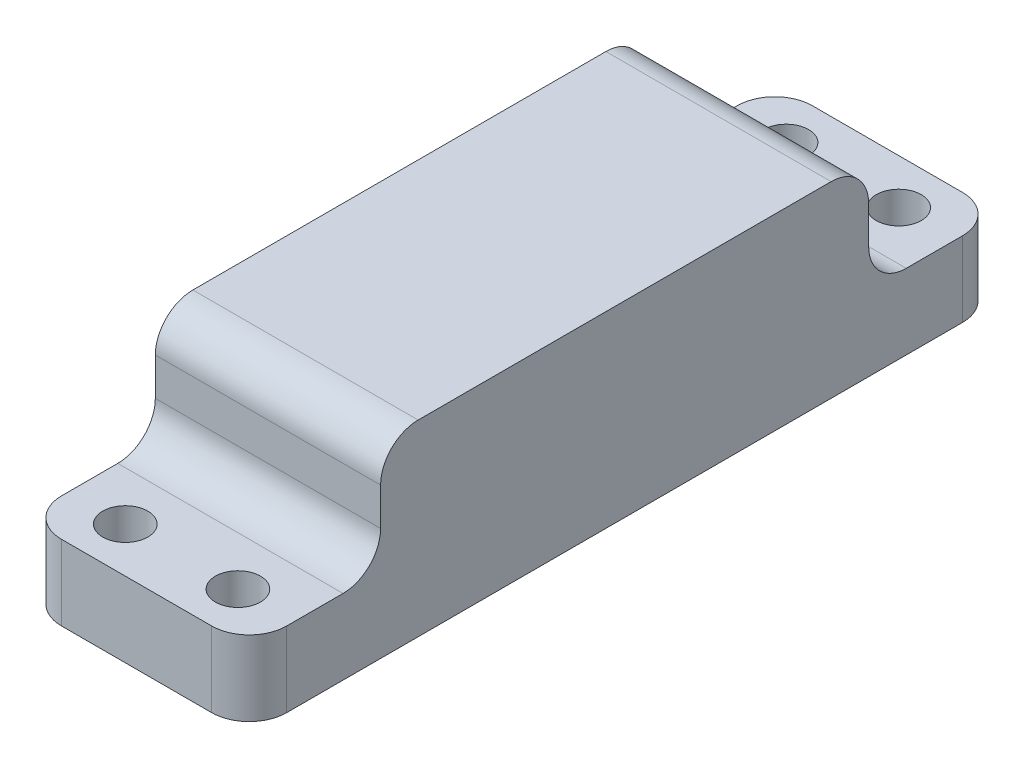
ISO-10303-21;
HEADER;
FILE_DESCRIPTION(('STEP AP214'),'2;1');
FILE_NAME('part.step','',(''),(''),'','','');
FILE_SCHEMA(('AUTOMOTIVE_DESIGN { 1 0 10303 214 1 1 1 1 }'));
ENDSEC;
DATA;
#1=APPLICATION_CONTEXT('core data for automotive mechanical design processes');
#2=APPLICATION_PROTOCOL_DEFINITION('international standard','automotive_design',2000,#1);
#3=PRODUCT_CONTEXT('',#1,'mechanical');
#4=PRODUCT('Part','Part','',(#3));
#5=PRODUCT_RELATED_PRODUCT_CATEGORY('part','',(#4));
#6=PRODUCT_DEFINITION_FORMATION('','',#4);
#7=PRODUCT_DEFINITION_CONTEXT('part definition',#1,'design');
#8=PRODUCT_DEFINITION('design','',#6,#7);
#9=PRODUCT_DEFINITION_SHAPE('','',#8);
#10=(LENGTH_UNIT() NAMED_UNIT(*) SI_UNIT(.MILLI.,.METRE.));
#11=(NAMED_UNIT(*) PLANE_ANGLE_UNIT() SI_UNIT($,.RADIAN.));
#12=(NAMED_UNIT(*) SI_UNIT($,.STERADIAN.) SOLID_ANGLE_UNIT());
#13=UNCERTAINTY_MEASURE_WITH_UNIT(LENGTH_MEASURE(1.E-05),#10,'distance_accuracy_value','');
#14=(GEOMETRIC_REPRESENTATION_CONTEXT(3) GLOBAL_UNCERTAINTY_ASSIGNED_CONTEXT((#13)) GLOBAL_UNIT_ASSIGNED_CONTEXT((#10,
#11,#12)) REPRESENTATION_CONTEXT('',''));
#15=CARTESIAN_POINT('',(0.,0.,0.));
#16=DIRECTION('',(0.,0.,1.));
#17=DIRECTION('',(1.,0.,0.));
#18=AXIS2_PLACEMENT_3D('',#15,#16,#17);
#19=CARTESIAN_POINT('',(-50.,30.,-10.));
#20=DIRECTION('',(0.,1.,0.));
#21=DIRECTION('',(0.,0.,1.));
#22=AXIS2_PLACEMENT_3D('',#19,#20,#21);
#23=CYLINDRICAL_SURFACE('',#22,10.);
#24=DIRECTION('',(0.,1.,0.));
#25=VECTOR('',#24,1.);
#26=CARTESIAN_POINT('',(-60.,30.,-10.));
#27=LINE('',#26,#25);
#28=CARTESIAN_POINT('',(-60.,0.,-10.));
#29=VERTEX_POINT('',#28);
#30=CARTESIAN_POINT('',(-60.,20.,-10.));
#31=VERTEX_POINT('',#30);
#32=EDGE_CURVE('E327',#29,#31,#27,.T.);
#33=ORIENTED_EDGE('',*,*,#32,.F.);
#34=CARTESIAN_POINT('',(-50.,0.,-10.));
#35=DIRECTION('',(0.,-1.,0.));
#36=DIRECTION('',(0.,0.,-1.));
#37=AXIS2_PLACEMENT_3D('',#34,#35,#36);
#38=CIRCLE('',#37,10.);
#39=CARTESIAN_POINT('',(-50.,0.,0.));
#40=VERTEX_POINT('',#39);
#41=EDGE_CURVE('E53',#40,#29,#38,.T.);
#42=ORIENTED_EDGE('',*,*,#41,.F.);
#43=DIRECTION('',(0.,1.,0.));
#44=VECTOR('',#43,1.);
#45=CARTESIAN_POINT('',(-50.,0.,0.));
#46=LINE('',#45,#44);
#47=CARTESIAN_POINT('',(-50.,20.,0.));
#48=VERTEX_POINT('',#47);
#49=EDGE_CURVE('E331',#48,#40,#46,.F.);
#50=ORIENTED_EDGE('',*,*,#49,.F.);
#51=CARTESIAN_POINT('',(-50.,20.,-10.));
#52=DIRECTION('',(0.,1.,0.));
#53=DIRECTION('',(0.,0.,1.));
#54=AXIS2_PLACEMENT_3D('',#51,#52,#53);
#55=CIRCLE('',#54,10.);
#56=EDGE_CURVE('E11',#31,#48,#55,.T.);
#57=ORIENTED_EDGE('',*,*,#56,.F.);
#58=EDGE_LOOP('',(#33,#42,#50,#57));
#59=FACE_BOUND('',#58,.T.);
#60=ADVANCED_FACE('F45',(#59),#23,.T.);
#61=CARTESIAN_POINT('',(-10.,30.,-10.));
#62=DIRECTION('',(0.,1.,0.));
#63=DIRECTION('',(0.,0.,1.));
#64=AXIS2_PLACEMENT_3D('',#61,#62,#63);
#65=CYLINDRICAL_SURFACE('',#64,10.);
#66=DIRECTION('',(0.,-1.,0.));
#67=VECTOR('',#66,1.);
#68=CARTESIAN_POINT('',(0.,30.,-10.));
#69=LINE('',#68,#67);
#70=CARTESIAN_POINT('',(0.,20.,-10.));
#71=VERTEX_POINT('',#70);
#72=CARTESIAN_POINT('',(0.,0.,-10.));
#73=VERTEX_POINT('',#72);
#74=EDGE_CURVE('E312',#71,#73,#69,.T.);
#75=ORIENTED_EDGE('',*,*,#74,.F.);
#76=CARTESIAN_POINT('',(-10.,20.,-10.));
#77=DIRECTION('',(0.,1.,0.));
#78=DIRECTION('',(0.,0.,1.));
#79=AXIS2_PLACEMENT_3D('',#76,#77,#78);
#80=CIRCLE('',#79,10.);
#81=CARTESIAN_POINT('',(-10.,20.,0.));
#82=VERTEX_POINT('',#81);
#83=EDGE_CURVE('E320',#82,#71,#80,.T.);
#84=ORIENTED_EDGE('',*,*,#83,.F.);
#85=DIRECTION('',(0.,-1.,0.));
#86=VECTOR('',#85,1.);
#87=CARTESIAN_POINT('',(-10.,30.,0.));
#88=LINE('',#87,#86);
#89=CARTESIAN_POINT('',(-10.,0.,0.));
#90=VERTEX_POINT('',#89);
#91=EDGE_CURVE('E316',#90,#82,#88,.F.);
#92=ORIENTED_EDGE('',*,*,#91,.F.);
#93=CARTESIAN_POINT('',(-10.,0.,-10.));
#94=DIRECTION('',(0.,-1.,0.));
#95=DIRECTION('',(0.,0.,-1.));
#96=AXIS2_PLACEMENT_3D('',#93,#94,#95);
#97=CIRCLE('',#96,10.);
#98=EDGE_CURVE('E323',#73,#90,#97,.T.);
#99=ORIENTED_EDGE('',*,*,#98,.F.);
#100=EDGE_LOOP('',(#75,#84,#92,#99));
#101=FACE_BOUND('',#100,.T.);
#102=ADVANCED_FACE('F453',(#101),#65,.T.);
#103=CARTESIAN_POINT('',(-10.,20.,-190.));
#104=DIRECTION('',(0.,1.,0.));
#105=DIRECTION('',(0.,0.,1.));
#106=AXIS2_PLACEMENT_3D('',#103,#104,#105);
#107=CYLINDRICAL_SURFACE('',#106,10.);
#108=DIRECTION('',(0.,-1.,0.));
#109=VECTOR('',#108,1.);
#110=CARTESIAN_POINT('',(-10.,20.,-200.));
#111=LINE('',#110,#109);
#112=CARTESIAN_POINT('',(-10.,20.,-200.));
#113=VERTEX_POINT('',#112);
#114=CARTESIAN_POINT('',(-10.,0.,-200.));
#115=VERTEX_POINT('',#114);
#116=EDGE_CURVE('E297',#113,#115,#111,.T.);
#117=ORIENTED_EDGE('',*,*,#116,.F.);
#118=CARTESIAN_POINT('',(-10.,20.,-190.));
#119=DIRECTION('',(0.,1.,0.));
#120=DIRECTION('',(0.,0.,1.));
#121=AXIS2_PLACEMENT_3D('',#118,#119,#120);
#122=CIRCLE('',#121,10.);
#123=CARTESIAN_POINT('',(0.,20.,-190.));
#124=VERTEX_POINT('',#123);
#125=EDGE_CURVE('E305',#124,#113,#122,.T.);
#126=ORIENTED_EDGE('',*,*,#125,.F.);
#127=DIRECTION('',(0.,-1.,0.));
#128=VECTOR('',#127,1.);
#129=CARTESIAN_POINT('',(0.,20.,-190.));
#130=LINE('',#129,#128);
#131=CARTESIAN_POINT('',(0.,0.,-190.));
#132=VERTEX_POINT('',#131);
#133=EDGE_CURVE('E301',#132,#124,#130,.F.);
#134=ORIENTED_EDGE('',*,*,#133,.F.);
#135=CARTESIAN_POINT('',(-10.,0.,-190.));
#136=DIRECTION('',(0.,-1.,0.));
#137=DIRECTION('',(0.,0.,-1.));
#138=AXIS2_PLACEMENT_3D('',#135,#136,#137);
#139=CIRCLE('',#138,10.);
#140=EDGE_CURVE('E308',#115,#132,#139,.T.);
#141=ORIENTED_EDGE('',*,*,#140,.F.);
#142=EDGE_LOOP('',(#117,#126,#134,#141));
#143=FACE_BOUND('',#142,.T.);
#144=ADVANCED_FACE('F441',(#143),#107,.T.);
#145=CARTESIAN_POINT('',(-50.,20.,-190.));
#146=DIRECTION('',(0.,1.,0.));
#147=DIRECTION('',(0.,0.,1.));
#148=AXIS2_PLACEMENT_3D('',#145,#146,#147);
#149=CYLINDRICAL_SURFACE('',#148,10.);
#150=DIRECTION('',(0.,1.,0.));
#151=VECTOR('',#150,1.);
#152=CARTESIAN_POINT('',(-50.,20.,-200.));
#153=LINE('',#152,#151);
#154=CARTESIAN_POINT('',(-50.,0.,-200.));
#155=VERTEX_POINT('',#154);
#156=CARTESIAN_POINT('',(-50.,20.,-200.));
#157=VERTEX_POINT('',#156);
#158=EDGE_CURVE('E256',#155,#157,#153,.T.);
#159=ORIENTED_EDGE('',*,*,#158,.F.);
#160=CARTESIAN_POINT('',(-50.,0.,-190.));
#161=DIRECTION('',(0.,-1.,0.));
#162=DIRECTION('',(0.,0.,-1.));
#163=AXIS2_PLACEMENT_3D('',#160,#161,#162);
#164=CIRCLE('',#163,10.);
#165=CARTESIAN_POINT('',(-60.,0.,-190.));
#166=VERTEX_POINT('',#165);
#167=EDGE_CURVE('E292',#166,#155,#164,.T.);
#168=ORIENTED_EDGE('',*,*,#167,.F.);
#169=DIRECTION('',(0.,1.,0.));
#170=VECTOR('',#169,1.);
#171=CARTESIAN_POINT('',(-60.,30.,-190.));
#172=LINE('',#171,#170);
#173=CARTESIAN_POINT('',(-60.,20.,-190.));
#174=VERTEX_POINT('',#173);
#175=EDGE_CURVE('E289',#174,#166,#172,.F.);
#176=ORIENTED_EDGE('',*,*,#175,.F.);
#177=CARTESIAN_POINT('',(-50.,20.,-190.));
#178=DIRECTION('',(0.,1.,0.));
#179=DIRECTION('',(0.,0.,1.));
#180=AXIS2_PLACEMENT_3D('',#177,#178,#179);
#181=CIRCLE('',#180,10.);
#182=EDGE_CURVE('E162',#157,#174,#181,.T.);
#183=ORIENTED_EDGE('',*,*,#182,.F.);
#184=EDGE_LOOP('',(#159,#168,#176,#183));
#185=FACE_BOUND('',#184,.T.);
#186=ADVANCED_FACE('F447',(#185),#149,.T.);
#187=CARTESIAN_POINT('',(-60.,0.,-200.));
#188=DIRECTION('',(0.,-1.,0.));
#189=DIRECTION('',(0.,0.,-1.));
#190=AXIS2_PLACEMENT_3D('',#187,#188,#189);
#191=PLANE('',#190);
#192=CARTESIAN_POINT('',(-15.,0.,-12.));
#193=DIRECTION('',(0.,1.,0.));
#194=DIRECTION('',(0.,0.,1.));
#195=AXIS2_PLACEMENT_3D('',#192,#193,#194);
#196=CIRCLE('',#195,3.99999999999999);
#197=CARTESIAN_POINT('',(-15.,0.,-8.00000000000001));
#198=VERTEX_POINT('',#197);
#199=EDGE_CURVE('E388',#198,#198,#196,.T.);
#200=ORIENTED_EDGE('',*,*,#199,.T.);
#201=EDGE_LOOP('',(#200));
#202=FACE_BOUND('',#201,.T.);
#203=CARTESIAN_POINT('',(-45.,0.,-12.));
#204=DIRECTION('',(0.,1.,0.));
#205=DIRECTION('',(0.,0.,1.));
#206=AXIS2_PLACEMENT_3D('',#203,#204,#205);
#207=CIRCLE('',#206,4.);
#208=CARTESIAN_POINT('',(-45.,0.,-8.));
#209=VERTEX_POINT('',#208);
#210=EDGE_CURVE('E372',#209,#209,#207,.T.);
#211=ORIENTED_EDGE('',*,*,#210,.T.);
#212=EDGE_LOOP('',(#211));
#213=FACE_BOUND('',#212,.T.);
#214=CARTESIAN_POINT('',(-45.,0.,-188.));
#215=DIRECTION('',(0.,1.,0.));
#216=DIRECTION('',(0.,0.,1.));
#217=AXIS2_PLACEMENT_3D('',#214,#215,#216);
#218=CIRCLE('',#217,4.);
#219=CARTESIAN_POINT('',(-45.,0.,-184.));
#220=VERTEX_POINT('',#219);
#221=EDGE_CURVE('E356',#220,#220,#218,.T.);
#222=ORIENTED_EDGE('',*,*,#221,.T.);
#223=EDGE_LOOP('',(#222));
#224=FACE_BOUND('',#223,.T.);
#225=CARTESIAN_POINT('',(-15.,0.,-188.));
#226=DIRECTION('',(0.,1.,0.));
#227=DIRECTION('',(0.,0.,1.));
#228=AXIS2_PLACEMENT_3D('',#225,#226,#227);
#229=CIRCLE('',#228,3.99999999999999);
#230=CARTESIAN_POINT('',(-15.,0.,-184.));
#231=VERTEX_POINT('',#230);
#232=EDGE_CURVE('E220',#231,#231,#229,.T.);
#233=ORIENTED_EDGE('',*,*,#232,.T.);
#234=EDGE_LOOP('',(#233));
#235=FACE_BOUND('',#234,.T.);
#236=DIRECTION('',(1.,0.,0.));
#237=VECTOR('',#236,1.);
#238=CARTESIAN_POINT('',(-60.,0.,0.));
#239=LINE('',#238,#237);
#240=EDGE_CURVE('E253',#40,#90,#239,.T.);
#241=ORIENTED_EDGE('',*,*,#240,.F.);
#242=ORIENTED_EDGE('',*,*,#41,.T.);
#243=DIRECTION('',(0.,0.,-1.));
#244=VECTOR('',#243,1.);
#245=CARTESIAN_POINT('',(-60.,0.,-200.));
#246=LINE('',#245,#244);
#247=EDGE_CURVE('E169',#29,#166,#246,.T.);
#248=ORIENTED_EDGE('',*,*,#247,.T.);
#249=ORIENTED_EDGE('',*,*,#167,.T.);
#250=DIRECTION('',(1.,0.,0.));
#251=VECTOR('',#250,1.);
#252=CARTESIAN_POINT('',(-60.,0.,-200.));
#253=LINE('',#252,#251);
#254=EDGE_CURVE('E215',#155,#115,#253,.T.);
#255=ORIENTED_EDGE('',*,*,#254,.T.);
#256=ORIENTED_EDGE('',*,*,#140,.T.);
#257=DIRECTION('',(0.,0.,-1.));
#258=VECTOR('',#257,1.);
#259=CARTESIAN_POINT('',(0.,0.,-200.));
#260=LINE('',#259,#258);
#261=EDGE_CURVE('E216',#73,#132,#260,.T.);
#262=ORIENTED_EDGE('',*,*,#261,.F.);
#263=ORIENTED_EDGE('',*,*,#98,.T.);
#264=EDGE_LOOP('',(#241,#242,#248,#249,#255,#256,#262,#263));
#265=FACE_BOUND('',#264,.T.);
#266=ADVANCED_FACE('F336',(#202,#213,#224,#235,#265),#191,.T.);
#267=CARTESIAN_POINT('',(-60.,0.,0.));
#268=DIRECTION('',(0.,0.,1.));
#269=DIRECTION('',(1.,0.,0.));
#270=AXIS2_PLACEMENT_3D('',#267,#268,#269);
#271=PLANE('',#270);
#272=DIRECTION('',(1.,0.,0.));
#273=VECTOR('',#272,1.);
#274=CARTESIAN_POINT('',(-60.,20.,0.));
#275=LINE('',#274,#273);
#276=EDGE_CURVE('E257',#48,#82,#275,.T.);
#277=ORIENTED_EDGE('',*,*,#276,.F.);
#278=ORIENTED_EDGE('',*,*,#49,.T.);
#279=ORIENTED_EDGE('',*,*,#240,.T.);
#280=ORIENTED_EDGE('',*,*,#91,.T.);
#281=EDGE_LOOP('',(#277,#278,#279,#280));
#282=FACE_BOUND('',#281,.T.);
#283=ADVANCED_FACE('F411',(#282),#271,.T.);
#284=CARTESIAN_POINT('',(-60.,20.,0.));
#285=DIRECTION('',(0.,1.,0.));
#286=DIRECTION('',(0.,0.,1.));
#287=AXIS2_PLACEMENT_3D('',#284,#285,#286);
#288=PLANE('',#287);
#289=CARTESIAN_POINT('',(-15.,20.,-12.));
#290=DIRECTION('',(0.,1.,0.));
#291=DIRECTION('',(0.,0.,1.));
#292=AXIS2_PLACEMENT_3D('',#289,#290,#291);
#293=CIRCLE('',#292,5.99999999999999);
#294=CARTESIAN_POINT('',(-15.,20.,-6.00000000000001));
#295=VERTEX_POINT('',#294);
#296=EDGE_CURVE('E400',#295,#295,#293,.T.);
#297=ORIENTED_EDGE('',*,*,#296,.F.);
#298=EDGE_LOOP('',(#297));
#299=FACE_BOUND('',#298,.T.);
#300=CARTESIAN_POINT('',(-45.,20.,-12.));
#301=DIRECTION('',(0.,1.,0.));
#302=DIRECTION('',(0.,0.,1.));
#303=AXIS2_PLACEMENT_3D('',#300,#301,#302);
#304=CIRCLE('',#303,6.);
#305=CARTESIAN_POINT('',(-45.,20.,-6.));
#306=VERTEX_POINT('',#305);
#307=EDGE_CURVE('E384',#306,#306,#304,.T.);
#308=ORIENTED_EDGE('',*,*,#307,.F.);
#309=EDGE_LOOP('',(#308));
#310=FACE_BOUND('',#309,.T.);
#311=DIRECTION('',(0.,0.,1.));
#312=VECTOR('',#311,1.);
#313=CARTESIAN_POINT('',(-60.,20.,0.));
#314=LINE('',#313,#312);
#315=CARTESIAN_POINT('',(-60.,20.,-24.9999999999999));
#316=VERTEX_POINT('',#315);
#317=EDGE_CURVE('E212',#316,#31,#314,.T.);
#318=ORIENTED_EDGE('',*,*,#317,.T.);
#319=ORIENTED_EDGE('',*,*,#56,.T.);
#320=ORIENTED_EDGE('',*,*,#276,.T.);
#321=ORIENTED_EDGE('',*,*,#83,.T.);
#322=DIRECTION('',(0.,0.,1.));
#323=VECTOR('',#322,1.);
#324=CARTESIAN_POINT('',(0.,20.,0.));
#325=LINE('',#324,#323);
#326=CARTESIAN_POINT('',(0.,20.,-24.9999999999999));
#327=VERTEX_POINT('',#326);
#328=EDGE_CURVE('E249',#327,#71,#325,.T.);
#329=ORIENTED_EDGE('',*,*,#328,.F.);
#330=DIRECTION('',(1.,0.,0.));
#331=VECTOR('',#330,1.);
#332=CARTESIAN_POINT('',(-60.,20.,-24.9999999999999));
#333=LINE('',#332,#331);
#334=EDGE_CURVE('E260',#316,#327,#333,.T.);
#335=ORIENTED_EDGE('',*,*,#334,.F.);
#336=EDGE_LOOP('',(#318,#319,#320,#321,#329,#335));
#337=FACE_BOUND('',#336,.T.);
#338=ADVANCED_FACE('F407',(#299,#310,#337),#288,.T.);
#339=CARTESIAN_POINT('',(-60.,30.,-25.));
#340=DIRECTION('',(1.,0.,0.));
#341=DIRECTION('',(0.,0.,-1.));
#342=AXIS2_PLACEMENT_3D('',#339,#340,#341);
#343=CYLINDRICAL_SURFACE('',#342,10.);
#344=CARTESIAN_POINT('',(0.,30.,-25.));
#345=DIRECTION('',(-1.,0.,0.));
#346=DIRECTION('',(0.,0.,1.));
#347=AXIS2_PLACEMENT_3D('',#344,#345,#346);
#348=CIRCLE('',#347,10.);
#349=CARTESIAN_POINT('',(0.,30.,-35.));
#350=VERTEX_POINT('',#349);
#351=EDGE_CURVE('E245',#350,#327,#348,.T.);
#352=ORIENTED_EDGE('',*,*,#351,.F.);
#353=DIRECTION('',(1.,0.,0.));
#354=VECTOR('',#353,1.);
#355=CARTESIAN_POINT('',(-60.,30.,-35.));
#356=LINE('',#355,#354);
#357=CARTESIAN_POINT('',(-60.,30.,-35.));
#358=VERTEX_POINT('',#357);
#359=EDGE_CURVE('E263',#358,#350,#356,.T.);
#360=ORIENTED_EDGE('',*,*,#359,.F.);
#361=CARTESIAN_POINT('',(-60.,30.,-25.));
#362=DIRECTION('',(-1.,0.,0.));
#363=DIRECTION('',(0.,0.,1.));
#364=AXIS2_PLACEMENT_3D('',#361,#362,#363);
#365=CIRCLE('',#364,10.);
#366=EDGE_CURVE('E208',#358,#316,#365,.T.);
#367=ORIENTED_EDGE('',*,*,#366,.T.);
#368=ORIENTED_EDGE('',*,*,#334,.T.);
#369=EDGE_LOOP('',(#352,#360,#367,#368));
#370=FACE_BOUND('',#369,.T.);
#371=ADVANCED_FACE('F410',(#370),#343,.F.);
#372=CARTESIAN_POINT('',(-60.,30.,-35.));
#373=DIRECTION('',(0.,0.,1.));
#374=DIRECTION('',(1.,0.,0.));
#375=AXIS2_PLACEMENT_3D('',#372,#373,#374);
#376=PLANE('',#375);
#377=DIRECTION('',(0.,-1.,0.));
#378=VECTOR('',#377,1.);
#379=CARTESIAN_POINT('',(0.,30.,-35.));
#380=LINE('',#379,#378);
#381=CARTESIAN_POINT('',(0.,39.9999999999999,-35.));
#382=VERTEX_POINT('',#381);
#383=EDGE_CURVE('E241',#382,#350,#380,.T.);
#384=ORIENTED_EDGE('',*,*,#383,.F.);
#385=DIRECTION('',(1.,0.,0.));
#386=VECTOR('',#385,1.);
#387=CARTESIAN_POINT('',(-60.,39.9999999999999,-35.));
#388=LINE('',#387,#386);
#389=CARTESIAN_POINT('',(-60.,39.9999999999999,-35.));
#390=VERTEX_POINT('',#389);
#391=EDGE_CURVE('E266',#390,#382,#388,.T.);
#392=ORIENTED_EDGE('',*,*,#391,.F.);
#393=DIRECTION('',(0.,-1.,0.));
#394=VECTOR('',#393,1.);
#395=CARTESIAN_POINT('',(-60.,30.,-35.));
#396=LINE('',#395,#394);
#397=EDGE_CURVE('E204',#390,#358,#396,.T.);
#398=ORIENTED_EDGE('',*,*,#397,.T.);
#399=ORIENTED_EDGE('',*,*,#359,.T.);
#400=EDGE_LOOP('',(#384,#392,#398,#399));
#401=FACE_BOUND('',#400,.T.);
#402=ADVANCED_FACE('F421',(#401),#376,.T.);
#403=CARTESIAN_POINT('',(-60.,40.,-45.));
#404=DIRECTION('',(1.,0.,0.));
#405=DIRECTION('',(0.,0.,-1.));
#406=AXIS2_PLACEMENT_3D('',#403,#404,#405);
#407=CYLINDRICAL_SURFACE('',#406,10.);
#408=CARTESIAN_POINT('',(0.,40.,-45.));
#409=DIRECTION('',(1.,0.,0.));
#410=DIRECTION('',(0.,0.,1.));
#411=AXIS2_PLACEMENT_3D('',#408,#409,#410);
#412=CIRCLE('',#411,10.);
#413=CARTESIAN_POINT('',(0.,50.,-45.0000000000001));
#414=VERTEX_POINT('',#413);
#415=EDGE_CURVE('E237',#414,#382,#412,.T.);
#416=ORIENTED_EDGE('',*,*,#415,.F.);
#417=DIRECTION('',(1.,0.,0.));
#418=VECTOR('',#417,1.);
#419=CARTESIAN_POINT('',(-60.,50.,-45.0000000000001));
#420=LINE('',#419,#418);
#421=CARTESIAN_POINT('',(-60.,50.,-45.0000000000001));
#422=VERTEX_POINT('',#421);
#423=EDGE_CURVE('E269',#422,#414,#420,.T.);
#424=ORIENTED_EDGE('',*,*,#423,.F.);
#425=CARTESIAN_POINT('',(-60.,40.,-45.));
#426=DIRECTION('',(1.,0.,0.));
#427=DIRECTION('',(0.,0.,1.));
#428=AXIS2_PLACEMENT_3D('',#425,#426,#427);
#429=CIRCLE('',#428,10.);
#430=EDGE_CURVE('E200',#422,#390,#429,.T.);
#431=ORIENTED_EDGE('',*,*,#430,.T.);
#432=ORIENTED_EDGE('',*,*,#391,.T.);
#433=EDGE_LOOP('',(#416,#424,#431,#432));
#434=FACE_BOUND('',#433,.T.);
#435=ADVANCED_FACE('F426',(#434),#407,.T.);
#436=CARTESIAN_POINT('',(-60.,50.,-45.0000000000001));
#437=DIRECTION('',(0.,1.,0.));
#438=DIRECTION('',(0.,0.,1.));
#439=AXIS2_PLACEMENT_3D('',#436,#437,#438);
#440=PLANE('',#439);
#441=DIRECTION('',(0.,0.,1.));
#442=VECTOR('',#441,1.);
#443=CARTESIAN_POINT('',(0.,50.,-45.0000000000001));
#444=LINE('',#443,#442);
#445=CARTESIAN_POINT('',(0.,50.,-155.));
#446=VERTEX_POINT('',#445);
#447=EDGE_CURVE('E233',#446,#414,#444,.T.);
#448=ORIENTED_EDGE('',*,*,#447,.F.);
#449=DIRECTION('',(1.,0.,0.));
#450=VECTOR('',#449,1.);
#451=CARTESIAN_POINT('',(-60.,50.,-155.));
#452=LINE('',#451,#450);
#453=CARTESIAN_POINT('',(-60.,50.,-155.));
#454=VERTEX_POINT('',#453);
#455=EDGE_CURVE('E272',#454,#446,#452,.T.);
#456=ORIENTED_EDGE('',*,*,#455,.F.);
#457=DIRECTION('',(0.,0.,1.));
#458=VECTOR('',#457,1.);
#459=CARTESIAN_POINT('',(-60.,50.,-45.0000000000001));
#460=LINE('',#459,#458);
#461=EDGE_CURVE('E196',#454,#422,#460,.T.);
#462=ORIENTED_EDGE('',*,*,#461,.T.);
#463=ORIENTED_EDGE('',*,*,#423,.T.);
#464=EDGE_LOOP('',(#448,#456,#462,#463));
#465=FACE_BOUND('',#464,.T.);
#466=ADVANCED_FACE('F429',(#465),#440,.T.);
#467=CARTESIAN_POINT('',(-60.,40.,-155.));
#468=DIRECTION('',(1.,0.,0.));
#469=DIRECTION('',(0.,0.,-1.));
#470=AXIS2_PLACEMENT_3D('',#467,#468,#469);
#471=CYLINDRICAL_SURFACE('',#470,10.);
#472=CARTESIAN_POINT('',(0.,40.,-155.));
#473=DIRECTION('',(1.,0.,0.));
#474=DIRECTION('',(0.,0.,-1.));
#475=AXIS2_PLACEMENT_3D('',#472,#473,#474);
#476=CIRCLE('',#475,10.);
#477=CARTESIAN_POINT('',(0.,39.9999999999999,-165.));
#478=VERTEX_POINT('',#477);
#479=EDGE_CURVE('E229',#478,#446,#476,.T.);
#480=ORIENTED_EDGE('',*,*,#479,.F.);
#481=DIRECTION('',(1.,0.,0.));
#482=VECTOR('',#481,1.);
#483=CARTESIAN_POINT('',(-60.,39.9999999999999,-165.));
#484=LINE('',#483,#482);
#485=CARTESIAN_POINT('',(-60.,39.9999999999999,-165.));
#486=VERTEX_POINT('',#485);
#487=EDGE_CURVE('E275',#486,#478,#484,.T.);
#488=ORIENTED_EDGE('',*,*,#487,.F.);
#489=CARTESIAN_POINT('',(-60.,40.,-155.));
#490=DIRECTION('',(1.,0.,0.));
#491=DIRECTION('',(0.,0.,-1.));
#492=AXIS2_PLACEMENT_3D('',#489,#490,#491);
#493=CIRCLE('',#492,10.);
#494=EDGE_CURVE('E189',#486,#454,#493,.T.);
#495=ORIENTED_EDGE('',*,*,#494,.T.);
#496=ORIENTED_EDGE('',*,*,#455,.T.);
#497=EDGE_LOOP('',(#480,#488,#495,#496));
#498=FACE_BOUND('',#497,.T.);
#499=ADVANCED_FACE('F432',(#498),#471,.T.);
#500=CARTESIAN_POINT('',(-60.,39.9999999999999,-165.));
#501=DIRECTION('',(0.,0.,-1.));
#502=DIRECTION('',(-1.,0.,0.));
#503=AXIS2_PLACEMENT_3D('',#500,#501,#502);
#504=PLANE('',#503);
#505=DIRECTION('',(0.,1.,0.));
#506=VECTOR('',#505,1.);
#507=CARTESIAN_POINT('',(0.,39.9999999999999,-165.));
#508=LINE('',#507,#506);
#509=CARTESIAN_POINT('',(0.,30.,-165.));
#510=VERTEX_POINT('',#509);
#511=EDGE_CURVE('E225',#510,#478,#508,.T.);
#512=ORIENTED_EDGE('',*,*,#511,.F.);
#513=DIRECTION('',(1.,0.,0.));
#514=VECTOR('',#513,1.);
#515=CARTESIAN_POINT('',(-60.,30.,-165.));
#516=LINE('',#515,#514);
#517=CARTESIAN_POINT('',(-60.,30.,-165.));
#518=VERTEX_POINT('',#517);
#519=EDGE_CURVE('E177',#518,#510,#516,.T.);
#520=ORIENTED_EDGE('',*,*,#519,.F.);
#521=DIRECTION('',(0.,1.,0.));
#522=VECTOR('',#521,1.);
#523=CARTESIAN_POINT('',(-60.,39.9999999999999,-165.));
#524=LINE('',#523,#522);
#525=EDGE_CURVE('E185',#518,#486,#524,.T.);
#526=ORIENTED_EDGE('',*,*,#525,.T.);
#527=ORIENTED_EDGE('',*,*,#487,.T.);
#528=EDGE_LOOP('',(#512,#520,#526,#527));
#529=FACE_BOUND('',#528,.T.);
#530=ADVANCED_FACE('F435',(#529),#504,.T.);
#531=CARTESIAN_POINT('',(-60.,30.,-175.));
#532=DIRECTION('',(1.,0.,0.));
#533=DIRECTION('',(0.,0.,-1.));
#534=AXIS2_PLACEMENT_3D('',#531,#532,#533);
#535=CYLINDRICAL_SURFACE('',#534,10.);
#536=CARTESIAN_POINT('',(0.,30.,-175.));
#537=DIRECTION('',(-1.,0.,0.));
#538=DIRECTION('',(0.,0.,1.));
#539=AXIS2_PLACEMENT_3D('',#536,#537,#538);
#540=CIRCLE('',#539,10.);
#541=CARTESIAN_POINT('',(0.,20.,-175.));
#542=VERTEX_POINT('',#541);
#543=EDGE_CURVE('E175',#542,#510,#540,.T.);
#544=ORIENTED_EDGE('',*,*,#543,.F.);
#545=DIRECTION('',(1.,0.,0.));
#546=VECTOR('',#545,1.);
#547=CARTESIAN_POINT('',(-60.,20.,-175.));
#548=LINE('',#547,#546);
#549=CARTESIAN_POINT('',(-60.,20.,-175.));
#550=VERTEX_POINT('',#549);
#551=EDGE_CURVE('E159',#550,#542,#548,.T.);
#552=ORIENTED_EDGE('',*,*,#551,.F.);
#553=CARTESIAN_POINT('',(-60.,30.,-175.));
#554=DIRECTION('',(-1.,0.,0.));
#555=DIRECTION('',(0.,0.,1.));
#556=AXIS2_PLACEMENT_3D('',#553,#554,#555);
#557=CIRCLE('',#556,10.);
#558=EDGE_CURVE('E168',#550,#518,#557,.T.);
#559=ORIENTED_EDGE('',*,*,#558,.T.);
#560=ORIENTED_EDGE('',*,*,#519,.T.);
#561=EDGE_LOOP('',(#544,#552,#559,#560));
#562=FACE_BOUND('',#561,.T.);
#563=ADVANCED_FACE('F173',(#562),#535,.F.);
#564=CARTESIAN_POINT('',(-60.,20.,-175.));
#565=DIRECTION('',(0.,1.,0.));
#566=DIRECTION('',(0.,0.,1.));
#567=AXIS2_PLACEMENT_3D('',#564,#565,#566);
#568=PLANE('',#567);
#569=CARTESIAN_POINT('',(-45.,20.,-188.));
#570=DIRECTION('',(0.,1.,0.));
#571=DIRECTION('',(0.,0.,1.));
#572=AXIS2_PLACEMENT_3D('',#569,#570,#571);
#573=CIRCLE('',#572,5.99999999999999);
#574=CARTESIAN_POINT('',(-45.,20.,-182.));
#575=VERTEX_POINT('',#574);
#576=EDGE_CURVE('E368',#575,#575,#573,.T.);
#577=ORIENTED_EDGE('',*,*,#576,.F.);
#578=EDGE_LOOP('',(#577));
#579=FACE_BOUND('',#578,.T.);
#580=CARTESIAN_POINT('',(-15.,20.,-188.));
#581=DIRECTION('',(0.,1.,0.));
#582=DIRECTION('',(0.,0.,1.));
#583=AXIS2_PLACEMENT_3D('',#580,#581,#582);
#584=CIRCLE('',#583,5.99999999999999);
#585=CARTESIAN_POINT('',(-15.,20.,-182.));
#586=VERTEX_POINT('',#585);
#587=EDGE_CURVE('E352',#586,#586,#584,.T.);
#588=ORIENTED_EDGE('',*,*,#587,.F.);
#589=EDGE_LOOP('',(#588));
#590=FACE_BOUND('',#589,.T.);
#591=DIRECTION('',(0.,0.,1.));
#592=VECTOR('',#591,1.);
#593=CARTESIAN_POINT('',(0.,20.,-175.));
#594=LINE('',#593,#592);
#595=EDGE_CURVE('E219',#124,#542,#594,.T.);
#596=ORIENTED_EDGE('',*,*,#595,.F.);
#597=ORIENTED_EDGE('',*,*,#125,.T.);
#598=DIRECTION('',(1.,0.,0.));
#599=VECTOR('',#598,1.);
#600=CARTESIAN_POINT('',(-60.,20.,-200.));
#601=LINE('',#600,#599);
#602=EDGE_CURVE('E178',#157,#113,#601,.T.);
#603=ORIENTED_EDGE('',*,*,#602,.F.);
#604=ORIENTED_EDGE('',*,*,#182,.T.);
#605=DIRECTION('',(0.,0.,1.));
#606=VECTOR('',#605,1.);
#607=CARTESIAN_POINT('',(-60.,20.,-175.));
#608=LINE('',#607,#606);
#609=EDGE_CURVE('E155',#174,#550,#608,.T.);
#610=ORIENTED_EDGE('',*,*,#609,.T.);
#611=ORIENTED_EDGE('',*,*,#551,.T.);
#612=EDGE_LOOP('',(#596,#597,#603,#604,#610,#611));
#613=FACE_BOUND('',#612,.T.);
#614=ADVANCED_FACE('F158',(#579,#590,#613),#568,.T.);
#615=CARTESIAN_POINT('',(-60.,20.,-200.));
#616=DIRECTION('',(0.,0.,-1.));
#617=DIRECTION('',(-1.,0.,0.));
#618=AXIS2_PLACEMENT_3D('',#615,#616,#617);
#619=PLANE('',#618);
#620=ORIENTED_EDGE('',*,*,#602,.T.);
#621=ORIENTED_EDGE('',*,*,#116,.T.);
#622=ORIENTED_EDGE('',*,*,#254,.F.);
#623=ORIENTED_EDGE('',*,*,#158,.T.);
#624=EDGE_LOOP('',(#620,#621,#622,#623));
#625=FACE_BOUND('',#624,.T.);
#626=ADVANCED_FACE('F444',(#625),#619,.T.);
#627=CARTESIAN_POINT('',(-60.,30.,-25.));
#628=DIRECTION('',(-1.,0.,0.));
#629=DIRECTION('',(0.,0.,1.));
#630=AXIS2_PLACEMENT_3D('',#627,#628,#629);
#631=PLANE('',#630);
#632=ORIENTED_EDGE('',*,*,#247,.F.);
#633=ORIENTED_EDGE('',*,*,#32,.T.);
#634=ORIENTED_EDGE('',*,*,#317,.F.);
#635=ORIENTED_EDGE('',*,*,#366,.F.);
#636=ORIENTED_EDGE('',*,*,#397,.F.);
#637=ORIENTED_EDGE('',*,*,#430,.F.);
#638=ORIENTED_EDGE('',*,*,#461,.F.);
#639=ORIENTED_EDGE('',*,*,#494,.F.);
#640=ORIENTED_EDGE('',*,*,#525,.F.);
#641=ORIENTED_EDGE('',*,*,#558,.F.);
#642=ORIENTED_EDGE('',*,*,#609,.F.);
#643=ORIENTED_EDGE('',*,*,#175,.T.);
#644=EDGE_LOOP('',(#632,#633,#634,#635,#636,#637,#638,#639,#640,#641,#642,#643));
#645=FACE_BOUND('',#644,.T.);
#646=ADVANCED_FACE('F182',(#645),#631,.T.);
#647=CARTESIAN_POINT('',(0.,30.,-25.));
#648=DIRECTION('',(-1.,0.,0.));
#649=DIRECTION('',(0.,0.,1.));
#650=AXIS2_PLACEMENT_3D('',#647,#648,#649);
#651=PLANE('',#650);
#652=ORIENTED_EDGE('',*,*,#328,.T.);
#653=ORIENTED_EDGE('',*,*,#74,.T.);
#654=ORIENTED_EDGE('',*,*,#261,.T.);
#655=ORIENTED_EDGE('',*,*,#133,.T.);
#656=ORIENTED_EDGE('',*,*,#595,.T.);
#657=ORIENTED_EDGE('',*,*,#543,.T.);
#658=ORIENTED_EDGE('',*,*,#511,.T.);
#659=ORIENTED_EDGE('',*,*,#479,.T.);
#660=ORIENTED_EDGE('',*,*,#447,.T.);
#661=ORIENTED_EDGE('',*,*,#415,.T.);
#662=ORIENTED_EDGE('',*,*,#383,.T.);
#663=ORIENTED_EDGE('',*,*,#351,.T.);
#664=EDGE_LOOP('',(#652,#653,#654,#655,#656,#657,#658,#659,#660,#661,#662,#663));
#665=FACE_BOUND('',#664,.T.);
#666=ADVANCED_FACE('F437',(#665),#651,.F.);
#667=CARTESIAN_POINT('',(-15.,20.,-188.));
#668=DIRECTION('',(0.,1.,0.));
#669=DIRECTION('',(0.,0.,1.));
#670=AXIS2_PLACEMENT_3D('',#667,#668,#669);
#671=CYLINDRICAL_SURFACE('',#670,4.);
#672=ORIENTED_EDGE('',*,*,#232,.F.);
#673=EDGE_LOOP('',(#672));
#674=FACE_BOUND('',#673,.T.);
#675=CARTESIAN_POINT('',(-15.,10.,-188.));
#676=DIRECTION('',(0.,1.,0.));
#677=DIRECTION('',(0.,0.,1.));
#678=AXIS2_PLACEMENT_3D('',#675,#676,#677);
#679=CIRCLE('',#678,4.);
#680=CARTESIAN_POINT('',(-15.,10.,-184.));
#681=VERTEX_POINT('',#680);
#682=EDGE_CURVE('E344',#681,#681,#679,.T.);
#683=ORIENTED_EDGE('',*,*,#682,.T.);
#684=EDGE_LOOP('',(#683));
#685=FACE_BOUND('',#684,.T.);
#686=ADVANCED_FACE('F532',(#674,#685),#671,.F.);
#687=CARTESIAN_POINT('',(-11.,10.,-188.));
#688=DIRECTION('',(0.,-1.,0.));
#689=DIRECTION('',(0.,0.,-1.));
#690=AXIS2_PLACEMENT_3D('',#687,#688,#689);
#691=PLANE('',#690);
#692=ORIENTED_EDGE('',*,*,#682,.F.);
#693=EDGE_LOOP('',(#692));
#694=FACE_BOUND('',#693,.T.);
#695=CARTESIAN_POINT('',(-15.,10.,-188.));
#696=DIRECTION('',(0.,1.,0.));
#697=DIRECTION('',(0.,0.,1.));
#698=AXIS2_PLACEMENT_3D('',#695,#696,#697);
#699=CIRCLE('',#698,5.99999999999999);
#700=CARTESIAN_POINT('',(-15.,10.,-182.));
#701=VERTEX_POINT('',#700);
#702=EDGE_CURVE('E348',#701,#701,#699,.T.);
#703=ORIENTED_EDGE('',*,*,#702,.T.);
#704=EDGE_LOOP('',(#703));
#705=FACE_BOUND('',#704,.T.);
#706=ADVANCED_FACE('F536',(#694,#705),#691,.F.);
#707=CARTESIAN_POINT('',(-15.,20.,-188.));
#708=DIRECTION('',(0.,1.,0.));
#709=DIRECTION('',(0.,0.,1.));
#710=AXIS2_PLACEMENT_3D('',#707,#708,#709);
#711=CYLINDRICAL_SURFACE('',#710,5.99999999999999);
#712=ORIENTED_EDGE('',*,*,#702,.F.);
#713=EDGE_LOOP('',(#712));
#714=FACE_BOUND('',#713,.T.);
#715=ORIENTED_EDGE('',*,*,#587,.T.);
#716=EDGE_LOOP('',(#715));
#717=FACE_BOUND('',#716,.T.);
#718=ADVANCED_FACE('F546',(#714,#717),#711,.F.);
#719=CARTESIAN_POINT('',(-45.,20.,-188.));
#720=DIRECTION('',(0.,1.,0.));
#721=DIRECTION('',(0.,0.,1.));
#722=AXIS2_PLACEMENT_3D('',#719,#720,#721);
#723=CYLINDRICAL_SURFACE('',#722,4.);
#724=ORIENTED_EDGE('',*,*,#221,.F.);
#725=EDGE_LOOP('',(#724));
#726=FACE_BOUND('',#725,.T.);
#727=CARTESIAN_POINT('',(-45.,10.,-188.));
#728=DIRECTION('',(0.,1.,0.));
#729=DIRECTION('',(0.,0.,1.));
#730=AXIS2_PLACEMENT_3D('',#727,#728,#729);
#731=CIRCLE('',#730,4.);
#732=CARTESIAN_POINT('',(-45.,10.,-184.));
#733=VERTEX_POINT('',#732);
#734=EDGE_CURVE('E360',#733,#733,#731,.T.);
#735=ORIENTED_EDGE('',*,*,#734,.T.);
#736=EDGE_LOOP('',(#735));
#737=FACE_BOUND('',#736,.T.);
#738=ADVANCED_FACE('F555',(#726,#737),#723,.F.);
#739=CARTESIAN_POINT('',(-41.,10.,-188.));
#740=DIRECTION('',(0.,-1.,0.));
#741=DIRECTION('',(0.,0.,-1.));
#742=AXIS2_PLACEMENT_3D('',#739,#740,#741);
#743=PLANE('',#742);
#744=ORIENTED_EDGE('',*,*,#734,.F.);
#745=EDGE_LOOP('',(#744));
#746=FACE_BOUND('',#745,.T.);
#747=CARTESIAN_POINT('',(-45.,10.,-188.));
#748=DIRECTION('',(0.,1.,0.));
#749=DIRECTION('',(0.,0.,1.));
#750=AXIS2_PLACEMENT_3D('',#747,#748,#749);
#751=CIRCLE('',#750,6.);
#752=CARTESIAN_POINT('',(-45.,10.,-182.));
#753=VERTEX_POINT('',#752);
#754=EDGE_CURVE('E364',#753,#753,#751,.T.);
#755=ORIENTED_EDGE('',*,*,#754,.T.);
#756=EDGE_LOOP('',(#755));
#757=FACE_BOUND('',#756,.T.);
#758=ADVANCED_FACE('F564',(#746,#757),#743,.F.);
#759=CARTESIAN_POINT('',(-45.,20.,-188.));
#760=DIRECTION('',(0.,1.,0.));
#761=DIRECTION('',(0.,0.,1.));
#762=AXIS2_PLACEMENT_3D('',#759,#760,#761);
#763=CYLINDRICAL_SURFACE('',#762,5.99999999999999);
#764=ORIENTED_EDGE('',*,*,#754,.F.);
#765=EDGE_LOOP('',(#764));
#766=FACE_BOUND('',#765,.T.);
#767=ORIENTED_EDGE('',*,*,#576,.T.);
#768=EDGE_LOOP('',(#767));
#769=FACE_BOUND('',#768,.T.);
#770=ADVANCED_FACE('F573',(#766,#769),#763,.F.);
#771=CARTESIAN_POINT('',(-45.,20.,-12.));
#772=DIRECTION('',(0.,1.,0.));
#773=DIRECTION('',(0.,0.,1.));
#774=AXIS2_PLACEMENT_3D('',#771,#772,#773);
#775=CYLINDRICAL_SURFACE('',#774,4.);
#776=ORIENTED_EDGE('',*,*,#210,.F.);
#777=EDGE_LOOP('',(#776));
#778=FACE_BOUND('',#777,.T.);
#779=CARTESIAN_POINT('',(-45.,10.,-12.));
#780=DIRECTION('',(0.,1.,0.));
#781=DIRECTION('',(0.,0.,1.));
#782=AXIS2_PLACEMENT_3D('',#779,#780,#781);
#783=CIRCLE('',#782,4.);
#784=CARTESIAN_POINT('',(-45.,10.,-8.));
#785=VERTEX_POINT('',#784);
#786=EDGE_CURVE('E376',#785,#785,#783,.T.);
#787=ORIENTED_EDGE('',*,*,#786,.T.);
#788=EDGE_LOOP('',(#787));
#789=FACE_BOUND('',#788,.T.);
#790=ADVANCED_FACE('F582',(#778,#789),#775,.F.);
#791=CARTESIAN_POINT('',(-41.,10.,-12.));
#792=DIRECTION('',(0.,-1.,0.));
#793=DIRECTION('',(0.,0.,-1.));
#794=AXIS2_PLACEMENT_3D('',#791,#792,#793);
#795=PLANE('',#794);
#796=ORIENTED_EDGE('',*,*,#786,.F.);
#797=EDGE_LOOP('',(#796));
#798=FACE_BOUND('',#797,.T.);
#799=CARTESIAN_POINT('',(-45.,10.,-12.));
#800=DIRECTION('',(0.,1.,0.));
#801=DIRECTION('',(0.,0.,1.));
#802=AXIS2_PLACEMENT_3D('',#799,#800,#801);
#803=CIRCLE('',#802,6.);
#804=CARTESIAN_POINT('',(-45.,10.,-6.));
#805=VERTEX_POINT('',#804);
#806=EDGE_CURVE('E380',#805,#805,#803,.T.);
#807=ORIENTED_EDGE('',*,*,#806,.T.);
#808=EDGE_LOOP('',(#807));
#809=FACE_BOUND('',#808,.T.);
#810=ADVANCED_FACE('F591',(#798,#809),#795,.F.);
#811=CARTESIAN_POINT('',(-45.,20.,-12.));
#812=DIRECTION('',(0.,1.,0.));
#813=DIRECTION('',(0.,0.,1.));
#814=AXIS2_PLACEMENT_3D('',#811,#812,#813);
#815=CYLINDRICAL_SURFACE('',#814,6.);
#816=ORIENTED_EDGE('',*,*,#806,.F.);
#817=EDGE_LOOP('',(#816));
#818=FACE_BOUND('',#817,.T.);
#819=ORIENTED_EDGE('',*,*,#307,.T.);
#820=EDGE_LOOP('',(#819));
#821=FACE_BOUND('',#820,.T.);
#822=ADVANCED_FACE('F600',(#818,#821),#815,.F.);
#823=CARTESIAN_POINT('',(-15.,20.,-12.));
#824=DIRECTION('',(0.,1.,0.));
#825=DIRECTION('',(0.,0.,1.));
#826=AXIS2_PLACEMENT_3D('',#823,#824,#825);
#827=CYLINDRICAL_SURFACE('',#826,4.);
#828=ORIENTED_EDGE('',*,*,#199,.F.);
#829=EDGE_LOOP('',(#828));
#830=FACE_BOUND('',#829,.T.);
#831=CARTESIAN_POINT('',(-15.,10.,-12.));
#832=DIRECTION('',(0.,1.,0.));
#833=DIRECTION('',(0.,0.,1.));
#834=AXIS2_PLACEMENT_3D('',#831,#832,#833);
#835=CIRCLE('',#834,4.);
#836=CARTESIAN_POINT('',(-15.,10.,-8.));
#837=VERTEX_POINT('',#836);
#838=EDGE_CURVE('E392',#837,#837,#835,.T.);
#839=ORIENTED_EDGE('',*,*,#838,.T.);
#840=EDGE_LOOP('',(#839));
#841=FACE_BOUND('',#840,.T.);
#842=ADVANCED_FACE('F609',(#830,#841),#827,.F.);
#843=CARTESIAN_POINT('',(-11.,10.,-12.));
#844=DIRECTION('',(0.,-1.,0.));
#845=DIRECTION('',(0.,0.,-1.));
#846=AXIS2_PLACEMENT_3D('',#843,#844,#845);
#847=PLANE('',#846);
#848=ORIENTED_EDGE('',*,*,#838,.F.);
#849=EDGE_LOOP('',(#848));
#850=FACE_BOUND('',#849,.T.);
#851=CARTESIAN_POINT('',(-15.,10.,-12.));
#852=DIRECTION('',(0.,1.,0.));
#853=DIRECTION('',(0.,0.,1.));
#854=AXIS2_PLACEMENT_3D('',#851,#852,#853);
#855=CIRCLE('',#854,5.99999999999999);
#856=CARTESIAN_POINT('',(-15.,10.,-6.00000000000001));
#857=VERTEX_POINT('',#856);
#858=EDGE_CURVE('E396',#857,#857,#855,.T.);
#859=ORIENTED_EDGE('',*,*,#858,.T.);
#860=EDGE_LOOP('',(#859));
#861=FACE_BOUND('',#860,.T.);
#862=ADVANCED_FACE('F618',(#850,#861),#847,.F.);
#863=CARTESIAN_POINT('',(-15.,20.,-12.));
#864=DIRECTION('',(0.,1.,0.));
#865=DIRECTION('',(0.,0.,1.));
#866=AXIS2_PLACEMENT_3D('',#863,#864,#865);
#867=CYLINDRICAL_SURFACE('',#866,5.99999999999999);
#868=ORIENTED_EDGE('',*,*,#858,.F.);
#869=EDGE_LOOP('',(#868));
#870=FACE_BOUND('',#869,.T.);
#871=ORIENTED_EDGE('',*,*,#296,.T.);
#872=EDGE_LOOP('',(#871));
#873=FACE_BOUND('',#872,.T.);
#874=ADVANCED_FACE('F405',(#870,#873),#867,.F.);
#875=CLOSED_SHELL('',(#60,#102,#144,#186,#266,#283,#338,#371,#402,#435,#466,#499,#530,#563,#614,
#626,#646,#666,#686,#706,#718,#738,#758,#770,#790,#810,#822,#842,#862,#874));
#876=MANIFOLD_SOLID_BREP('B2',#875);
#877=ADVANCED_BREP_SHAPE_REPRESENTATION('',(#18,#876),#14);
#878=SHAPE_DEFINITION_REPRESENTATION(#9,#877);
ENDSEC;
END-ISO-10303-21;
